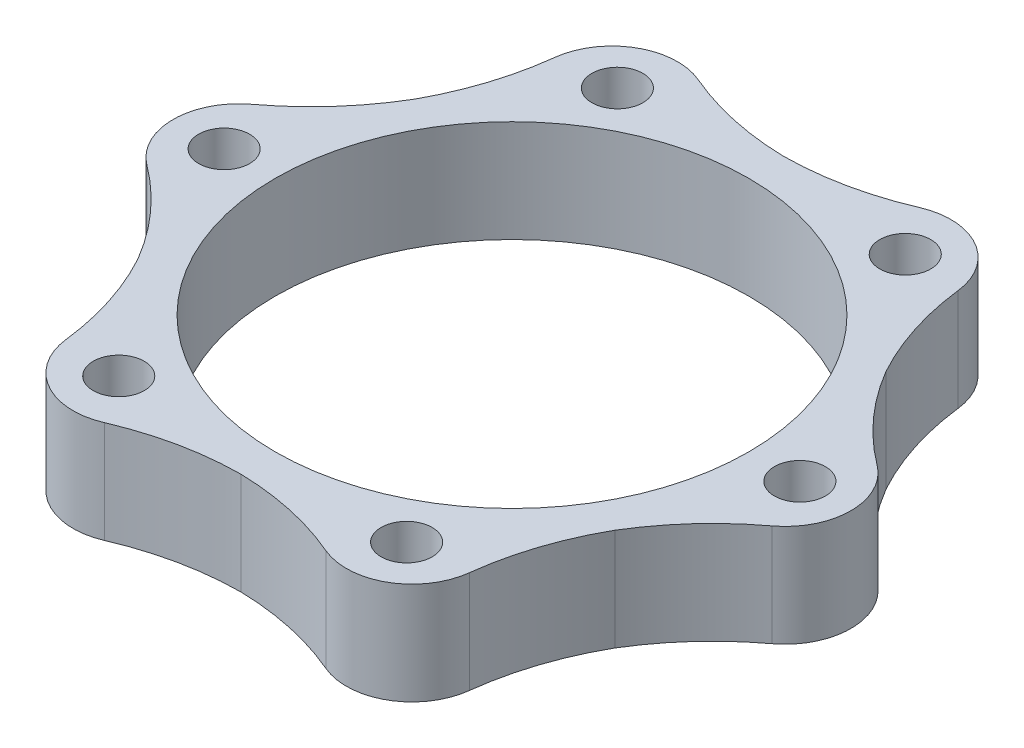
ISO-10303-21;
HEADER;
FILE_DESCRIPTION(('STEP AP214'),'2;1');
FILE_NAME('part.step','',(''),(''),'','','');
FILE_SCHEMA(('AUTOMOTIVE_DESIGN { 1 0 10303 214 1 1 1 1 }'));
ENDSEC;
DATA;
#1=APPLICATION_CONTEXT('core data for automotive mechanical design processes');
#2=APPLICATION_PROTOCOL_DEFINITION('international standard','automotive_design',2000,#1);
#3=PRODUCT_CONTEXT('',#1,'mechanical');
#4=PRODUCT('Part','Part','',(#3));
#5=PRODUCT_RELATED_PRODUCT_CATEGORY('part','',(#4));
#6=PRODUCT_DEFINITION_FORMATION('','',#4);
#7=PRODUCT_DEFINITION_CONTEXT('part definition',#1,'design');
#8=PRODUCT_DEFINITION('design','',#6,#7);
#9=PRODUCT_DEFINITION_SHAPE('','',#8);
#10=(LENGTH_UNIT() NAMED_UNIT(*) SI_UNIT(.MILLI.,.METRE.));
#11=(NAMED_UNIT(*) PLANE_ANGLE_UNIT() SI_UNIT($,.RADIAN.));
#12=(NAMED_UNIT(*) SI_UNIT($,.STERADIAN.) SOLID_ANGLE_UNIT());
#13=UNCERTAINTY_MEASURE_WITH_UNIT(LENGTH_MEASURE(1.E-05),#10,'distance_accuracy_value','');
#14=(GEOMETRIC_REPRESENTATION_CONTEXT(3) GLOBAL_UNCERTAINTY_ASSIGNED_CONTEXT((#13)) GLOBAL_UNIT_ASSIGNED_CONTEXT((#10,
#11,#12)) REPRESENTATION_CONTEXT('',''));
#15=CARTESIAN_POINT('',(0.,0.,0.));
#16=DIRECTION('',(0.,0.,1.));
#17=DIRECTION('',(1.,0.,0.));
#18=AXIS2_PLACEMENT_3D('',#15,#16,#17);
#19=CARTESIAN_POINT('',(0.,0.,0.));
#20=DIRECTION('',(0.,1.,0.));
#21=DIRECTION('',(0.,0.,1.));
#22=AXIS2_PLACEMENT_3D('',#19,#20,#21);
#23=PLANE('',#22);
#24=CARTESIAN_POINT('',(-12.5412500000003,0.,21.722082190423));
#25=DIRECTION('',(0.,1.,0.));
#26=DIRECTION('',(0.866025403784433,0.,0.50000000000001));
#27=AXIS2_PLACEMENT_3D('',#24,#25,#26);
#28=CIRCLE('',#27,2.2225);
#29=CARTESIAN_POINT('',(-10.6165085400894,0.,22.8333321904231));
#30=VERTEX_POINT('',#29);
#31=EDGE_CURVE('E493',#30,#30,#28,.T.);
#32=ORIENTED_EDGE('',*,*,#31,.T.);
#33=EDGE_LOOP('',(#32));
#34=FACE_BOUND('',#33,.T.);
#35=CARTESIAN_POINT('',(12.5412499999998,0.,21.7220821904233));
#36=DIRECTION('',(0.,1.,0.));
#37=DIRECTION('',(0.866025403784443,0.,-0.499999999999992));
#38=AXIS2_PLACEMENT_3D('',#35,#36,#37);
#39=CIRCLE('',#38,2.2225);
#40=CARTESIAN_POINT('',(14.4659914599107,0.,20.6108321904233));
#41=VERTEX_POINT('',#40);
#42=EDGE_CURVE('E489',#41,#41,#39,.T.);
#43=ORIENTED_EDGE('',*,*,#42,.T.);
#44=EDGE_LOOP('',(#43));
#45=FACE_BOUND('',#44,.T.);
#46=CARTESIAN_POINT('',(25.0825,0.,0.));
#47=DIRECTION('',(0.,1.,0.));
#48=DIRECTION('',(0.,0.,-1.));
#49=AXIS2_PLACEMENT_3D('',#46,#47,#48);
#50=CIRCLE('',#49,2.2225);
#51=CARTESIAN_POINT('',(25.0825,0.,-2.2225));
#52=VERTEX_POINT('',#51);
#53=EDGE_CURVE('E484',#52,#52,#50,.T.);
#54=ORIENTED_EDGE('',*,*,#53,.T.);
#55=EDGE_LOOP('',(#54));
#56=FACE_BOUND('',#55,.T.);
#57=CARTESIAN_POINT('',(12.5412500000001,0.,-21.7220821904231));
#58=DIRECTION('',(0.,1.,0.));
#59=DIRECTION('',(-0.866025403784436,0.,-0.500000000000004));
#60=AXIS2_PLACEMENT_3D('',#57,#58,#59);
#61=CIRCLE('',#60,2.2225);
#62=CARTESIAN_POINT('',(10.6165085400892,0.,-22.8333321904231));
#63=VERTEX_POINT('',#62);
#64=EDGE_CURVE('E482',#63,#63,#61,.T.);
#65=ORIENTED_EDGE('',*,*,#64,.T.);
#66=EDGE_LOOP('',(#65));
#67=FACE_BOUND('',#66,.T.);
#68=CARTESIAN_POINT('',(-12.54125,0.,-21.7220821904232));
#69=DIRECTION('',(0.,1.,0.));
#70=DIRECTION('',(-0.86602540378444,0.,0.499999999999998));
#71=AXIS2_PLACEMENT_3D('',#68,#69,#70);
#72=CIRCLE('',#71,2.2225);
#73=CARTESIAN_POINT('',(-14.4659914599109,0.,-20.6108321904232));
#74=VERTEX_POINT('',#73);
#75=EDGE_CURVE('E290',#74,#74,#72,.T.);
#76=ORIENTED_EDGE('',*,*,#75,.T.);
#77=EDGE_LOOP('',(#76));
#78=FACE_BOUND('',#77,.T.);
#79=CARTESIAN_POINT('',(-25.0825,0.,0.));
#80=DIRECTION('',(0.,1.,0.));
#81=DIRECTION('',(0.,0.,1.));
#82=AXIS2_PLACEMENT_3D('',#79,#80,#81);
#83=CIRCLE('',#82,2.2225);
#84=CARTESIAN_POINT('',(-25.0825,0.,2.2225));
#85=VERTEX_POINT('',#84);
#86=EDGE_CURVE('E285',#85,#85,#83,.T.);
#87=ORIENTED_EDGE('',*,*,#86,.T.);
#88=EDGE_LOOP('',(#87));
#89=FACE_BOUND('',#88,.T.);
#90=CARTESIAN_POINT('',(-11.90625,0.,20.622229927617));
#91=DIRECTION('',(0.,1.,0.));
#92=DIRECTION('',(0.,0.,1.));
#93=AXIS2_PLACEMENT_3D('',#90,#91,#92);
#94=CIRCLE('',#93,5.715);
#95=CARTESIAN_POINT('',(-9.65056900120422,0.,25.8732420425975));
#96=VERTEX_POINT('',#95);
#97=CARTESIAN_POINT('',(-17.5819082559492,0.,21.2916538304433));
#98=VERTEX_POINT('',#97);
#99=EDGE_CURVE('E175',#96,#98,#94,.F.);
#100=ORIENTED_EDGE('',*,*,#99,.T.);
#101=CARTESIAN_POINT('',(-42.807056060168,0.,24.2668711763381));
#102=DIRECTION('',(0.,1.,0.));
#103=DIRECTION('',(0.,0.,1.));
#104=AXIS2_PLACEMENT_3D('',#101,#102,#103);
#105=CIRCLE('',#104,25.4);
#106=CARTESIAN_POINT('',(-20.5309838709677,0.,12.0629124816548));
#107=VERTEX_POINT('',#106);
#108=EDGE_CURVE('E168',#98,#107,#105,.T.);
#109=ORIENTED_EDGE('',*,*,#108,.T.);
#110=CARTESIAN_POINT('',(-42.4307,0.,24.9300191287532));
#111=DIRECTION('',(0.,1.,0.));
#112=DIRECTION('',(0.,0.,1.));
#113=AXIS2_PLACEMENT_3D('',#110,#111,#112);
#114=CIRCLE('',#113,25.4);
#115=CARTESIAN_POINT('',(-27.2321693877551,0.,4.5789831052812));
#116=VERTEX_POINT('',#115);
#117=EDGE_CURVE('E172',#107,#116,#114,.T.);
#118=ORIENTED_EDGE('',*,*,#117,.T.);
#119=CARTESIAN_POINT('',(-23.8125,0.,0.));
#120=DIRECTION('',(0.,1.,0.));
#121=DIRECTION('',(0.,0.,1.));
#122=AXIS2_PLACEMENT_3D('',#119,#120,#121);
#123=CIRCLE('',#122,5.715);
#124=CARTESIAN_POINT('',(-27.2321693877551,0.,-4.5789831052812));
#125=VERTEX_POINT('',#124);
#126=EDGE_CURVE('E336',#116,#125,#123,.F.);
#127=ORIENTED_EDGE('',*,*,#126,.T.);
#128=CARTESIAN_POINT('',(-42.4307,0.,-24.9300191287532));
#129=DIRECTION('',(0.,1.,0.));
#130=DIRECTION('',(0.,0.,1.));
#131=AXIS2_PLACEMENT_3D('',#128,#129,#130);
#132=CIRCLE('',#131,25.4);
#133=CARTESIAN_POINT('',(-20.5309838709677,0.,-12.0629124816548));
#134=VERTEX_POINT('',#133);
#135=EDGE_CURVE('E208',#125,#134,#132,.T.);
#136=ORIENTED_EDGE('',*,*,#135,.T.);
#137=CARTESIAN_POINT('',(-42.8070560601683,0.,-24.2668711763375));
#138=DIRECTION('',(0.,1.,0.));
#139=DIRECTION('',(0.,0.,1.));
#140=AXIS2_PLACEMENT_3D('',#137,#138,#139);
#141=CIRCLE('',#140,25.4);
#142=CARTESIAN_POINT('',(-17.5819082559495,0.,-21.2916538304431));
#143=VERTEX_POINT('',#142);
#144=EDGE_CURVE('E11',#134,#143,#141,.T.);
#145=ORIENTED_EDGE('',*,*,#144,.T.);
#146=CARTESIAN_POINT('',(-11.9062500000002,0.,-20.6222299276168));
#147=DIRECTION('',(0.,1.,0.));
#148=DIRECTION('',(0.,0.,1.));
#149=AXIS2_PLACEMENT_3D('',#146,#147,#148);
#150=CIRCLE('',#149,5.715);
#151=CARTESIAN_POINT('',(-9.6481589777738,0.,-25.8722061118809));
#152=VERTEX_POINT('',#151);
#153=EDGE_CURVE('E309',#143,#152,#150,.F.);
#154=ORIENTED_EDGE('',*,*,#153,.T.);
#155=CARTESIAN_POINT('',(0.387801121010369,0.,-49.2054335974992));
#156=DIRECTION('',(0.,1.,0.));
#157=DIRECTION('',(0.,0.,1.));
#158=AXIS2_PLACEMENT_3D('',#155,#156,#157);
#159=CIRCLE('',#158,25.4);
#160=CARTESIAN_POINT('',(-0.181296717257759,0.,-23.811809837774));
#161=VERTEX_POINT('',#160);
#162=EDGE_CURVE('E278',#152,#161,#159,.T.);
#163=ORIENTED_EDGE('',*,*,#162,.T.);
#164=CARTESIAN_POINT('',(-0.374679882332703,0.,-49.211073664733));
#165=DIRECTION('',(0.,1.,0.));
#166=DIRECTION('',(0.,0.,1.));
#167=AXIS2_PLACEMENT_3D('',#164,#165,#166);
#168=CIRCLE('',#167,25.4);
#169=CARTESIAN_POINT('',(9.65056900120404,0.,-25.8732420425975));
#170=VERTEX_POINT('',#169);
#171=EDGE_CURVE('E271',#161,#170,#168,.T.);
#172=ORIENTED_EDGE('',*,*,#171,.T.);
#173=CARTESIAN_POINT('',(11.9062499999998,0.,-20.6222299276171));
#174=DIRECTION('',(0.,1.,0.));
#175=DIRECTION('',(0.,0.,1.));
#176=AXIS2_PLACEMENT_3D('',#173,#174,#175);
#177=CIRCLE('',#176,5.715);
#178=CARTESIAN_POINT('',(17.581908255949,0.,-21.2916538304434));
#179=VERTEX_POINT('',#178);
#180=EDGE_CURVE('E314',#170,#179,#177,.F.);
#181=ORIENTED_EDGE('',*,*,#180,.T.);
#182=CARTESIAN_POINT('',(42.8070560601678,0.,-24.2668711763384));
#183=DIRECTION('',(0.,1.,0.));
#184=DIRECTION('',(0.,0.,1.));
#185=AXIS2_PLACEMENT_3D('',#182,#183,#184);
#186=CIRCLE('',#185,25.4);
#187=CARTESIAN_POINT('',(20.5309838709677,0.,-12.0629124816548));
#188=VERTEX_POINT('',#187);
#189=EDGE_CURVE('E267',#179,#188,#186,.T.);
#190=ORIENTED_EDGE('',*,*,#189,.T.);
#191=CARTESIAN_POINT('',(42.4307,0.,-24.9300191287532));
#192=DIRECTION('',(0.,1.,0.));
#193=DIRECTION('',(0.,0.,1.));
#194=AXIS2_PLACEMENT_3D('',#191,#192,#193);
#195=CIRCLE('',#194,25.4);
#196=CARTESIAN_POINT('',(27.2321693877551,0.,-4.5789831052812));
#197=VERTEX_POINT('',#196);
#198=EDGE_CURVE('E255',#188,#197,#195,.T.);
#199=ORIENTED_EDGE('',*,*,#198,.T.);
#200=CARTESIAN_POINT('',(23.8125,0.,0.));
#201=DIRECTION('',(0.,1.,0.));
#202=DIRECTION('',(0.,0.,1.));
#203=AXIS2_PLACEMENT_3D('',#200,#201,#202);
#204=CIRCLE('',#203,5.715);
#205=CARTESIAN_POINT('',(27.2300672337227,0.,4.58055228143776));
#206=VERTEX_POINT('',#205);
#207=EDGE_CURVE('E320',#197,#206,#204,.F.);
#208=ORIENTED_EDGE('',*,*,#207,.T.);
#209=CARTESIAN_POINT('',(42.4192549391571,0.,24.9385624211611));
#210=DIRECTION('',(0.,1.,0.));
#211=DIRECTION('',(0.,0.,1.));
#212=AXIS2_PLACEMENT_3D('',#209,#210,#211);
#213=CIRCLE('',#212,25.4);
#214=CARTESIAN_POINT('',(20.7122805882253,0.,11.7488973561192));
#215=VERTEX_POINT('',#214);
#216=EDGE_CURVE('E250',#206,#215,#213,.T.);
#217=ORIENTED_EDGE('',*,*,#216,.T.);
#218=CARTESIAN_POINT('',(42.8053798823324,0.,24.2810545359796));
#219=DIRECTION('',(0.,1.,0.));
#220=DIRECTION('',(0.,0.,1.));
#221=AXIS2_PLACEMENT_3D('',#218,#219,#220);
#222=CIRCLE('',#221,25.4);
#223=CARTESIAN_POINT('',(17.5816003865509,0.,21.2942589373162));
#224=VERTEX_POINT('',#223);
#225=EDGE_CURVE('E238',#215,#224,#222,.T.);
#226=ORIENTED_EDGE('',*,*,#225,.T.);
#227=CARTESIAN_POINT('',(11.9062500000001,0.,20.6222299276169));
#228=DIRECTION('',(0.,1.,0.));
#229=DIRECTION('',(0.,0.,1.));
#230=AXIS2_PLACEMENT_3D('',#227,#228,#229);
#231=CIRCLE('',#230,5.715);
#232=CARTESIAN_POINT('',(9.64815897777362,0.,25.872206111881));
#233=VERTEX_POINT('',#232);
#234=EDGE_CURVE('E326',#224,#233,#231,.F.);
#235=ORIENTED_EDGE('',*,*,#234,.T.);
#236=CARTESIAN_POINT('',(-0.387801121010724,0.,49.2054335974992));
#237=DIRECTION('',(0.,1.,0.));
#238=DIRECTION('',(0.,0.,1.));
#239=AXIS2_PLACEMENT_3D('',#236,#237,#238);
#240=CIRCLE('',#239,25.4);
#241=CARTESIAN_POINT('',(0.1812967172576,0.,23.811809837774));
#242=VERTEX_POINT('',#241);
#243=EDGE_CURVE('E233',#233,#242,#240,.T.);
#244=ORIENTED_EDGE('',*,*,#243,.T.);
#245=CARTESIAN_POINT('',(0.374679882332373,0.,49.211073664733));
#246=DIRECTION('',(0.,1.,0.));
#247=DIRECTION('',(0.,0.,1.));
#248=AXIS2_PLACEMENT_3D('',#245,#246,#247);
#249=CIRCLE('',#248,25.4);
#250=EDGE_CURVE('E221',#242,#96,#249,.T.);
#251=ORIENTED_EDGE('',*,*,#250,.T.);
#252=EDGE_LOOP('',(#100,#109,#118,#127,#136,#145,#154,#163,#172,#181,#190,#199,#208,#217,#226,
#235,#244,#251));
#253=FACE_BOUND('',#252,.T.);
#254=CARTESIAN_POINT('',(0.,0.,0.));
#255=DIRECTION('',(0.,1.,0.));
#256=DIRECTION('',(0.,0.,1.));
#257=AXIS2_PLACEMENT_3D('',#254,#255,#256);
#258=CIRCLE('',#257,20.6375);
#259=CARTESIAN_POINT('',(0.,0.,20.6375));
#260=VERTEX_POINT('',#259);
#261=EDGE_CURVE('E195',#260,#260,#258,.T.);
#262=ORIENTED_EDGE('',*,*,#261,.T.);
#263=EDGE_LOOP('',(#262));
#264=FACE_BOUND('',#263,.T.);
#265=ADVANCED_FACE('F41',(#34,#45,#56,#67,#78,#89,#253,#264),#23,.F.);
#266=CARTESIAN_POINT('',(0.,76.2419209080187,0.));
#267=DIRECTION('',(0.,-1.,0.));
#268=DIRECTION('',(0.,0.,-1.));
#269=AXIS2_PLACEMENT_3D('',#266,#267,#268);
#270=CYLINDRICAL_SURFACE('',#269,20.6375);
#271=ORIENTED_EDGE('',*,*,#261,.F.);
#272=EDGE_LOOP('',(#271));
#273=FACE_BOUND('',#272,.T.);
#274=CARTESIAN_POINT('',(0.,8.89,0.));
#275=DIRECTION('',(0.,1.,0.));
#276=DIRECTION('',(0.,0.,1.));
#277=AXIS2_PLACEMENT_3D('',#274,#275,#276);
#278=CIRCLE('',#277,20.6375);
#279=CARTESIAN_POINT('',(0.,8.89,20.6375));
#280=VERTEX_POINT('',#279);
#281=EDGE_CURVE('E199',#280,#280,#278,.T.);
#282=ORIENTED_EDGE('',*,*,#281,.T.);
#283=EDGE_LOOP('',(#282));
#284=FACE_BOUND('',#283,.T.);
#285=ADVANCED_FACE('F368',(#273,#284),#270,.F.);
#286=CARTESIAN_POINT('',(0.,8.89,0.));
#287=DIRECTION('',(0.,1.,0.));
#288=DIRECTION('',(0.,0.,-1.));
#289=AXIS2_PLACEMENT_3D('',#286,#287,#288);
#290=PLANE('',#289);
#291=CARTESIAN_POINT('',(-12.5412500000003,8.89,21.722082190423));
#292=DIRECTION('',(0.,1.,0.));
#293=DIRECTION('',(0.,0.,1.));
#294=AXIS2_PLACEMENT_3D('',#291,#292,#293);
#295=CIRCLE('',#294,2.2225);
#296=CARTESIAN_POINT('',(-12.5412500000003,8.89,23.944582190423));
#297=VERTEX_POINT('',#296);
#298=EDGE_CURVE('E45',#297,#297,#295,.T.);
#299=ORIENTED_EDGE('',*,*,#298,.F.);
#300=EDGE_LOOP('',(#299));
#301=FACE_BOUND('',#300,.T.);
#302=CARTESIAN_POINT('',(12.5412499999998,8.89,21.7220821904233));
#303=DIRECTION('',(0.,1.,0.));
#304=DIRECTION('',(0.,0.,1.));
#305=AXIS2_PLACEMENT_3D('',#302,#303,#304);
#306=CIRCLE('',#305,2.2225);
#307=CARTESIAN_POINT('',(12.5412499999998,8.89,23.9445821904233));
#308=VERTEX_POINT('',#307);
#309=EDGE_CURVE('E295',#308,#308,#306,.T.);
#310=ORIENTED_EDGE('',*,*,#309,.F.);
#311=EDGE_LOOP('',(#310));
#312=FACE_BOUND('',#311,.T.);
#313=CARTESIAN_POINT('',(25.0825,8.89,0.));
#314=DIRECTION('',(0.,1.,0.));
#315=DIRECTION('',(0.,0.,1.));
#316=AXIS2_PLACEMENT_3D('',#313,#314,#315);
#317=CIRCLE('',#316,2.2225);
#318=CARTESIAN_POINT('',(25.0825,8.89,2.2225));
#319=VERTEX_POINT('',#318);
#320=EDGE_CURVE('E293',#319,#319,#317,.T.);
#321=ORIENTED_EDGE('',*,*,#320,.F.);
#322=EDGE_LOOP('',(#321));
#323=FACE_BOUND('',#322,.T.);
#324=CARTESIAN_POINT('',(12.5412500000001,8.89,-21.7220821904231));
#325=DIRECTION('',(0.,1.,0.));
#326=DIRECTION('',(0.,0.,1.));
#327=AXIS2_PLACEMENT_3D('',#324,#325,#326);
#328=CIRCLE('',#327,2.2225);
#329=CARTESIAN_POINT('',(12.5412500000001,8.89,-19.4995821904231));
#330=VERTEX_POINT('',#329);
#331=EDGE_CURVE('E289',#330,#330,#328,.T.);
#332=ORIENTED_EDGE('',*,*,#331,.F.);
#333=EDGE_LOOP('',(#332));
#334=FACE_BOUND('',#333,.T.);
#335=CARTESIAN_POINT('',(-12.54125,8.89,-21.7220821904232));
#336=DIRECTION('',(0.,1.,0.));
#337=DIRECTION('',(0.,0.,1.));
#338=AXIS2_PLACEMENT_3D('',#335,#336,#337);
#339=CIRCLE('',#338,2.2225);
#340=CARTESIAN_POINT('',(-12.54125,8.89,-19.4995821904232));
#341=VERTEX_POINT('',#340);
#342=EDGE_CURVE('E286',#341,#341,#339,.T.);
#343=ORIENTED_EDGE('',*,*,#342,.F.);
#344=EDGE_LOOP('',(#343));
#345=FACE_BOUND('',#344,.T.);
#346=CARTESIAN_POINT('',(-25.0825,8.89,0.));
#347=DIRECTION('',(0.,1.,0.));
#348=DIRECTION('',(0.,0.,1.));
#349=AXIS2_PLACEMENT_3D('',#346,#347,#348);
#350=CIRCLE('',#349,2.2225);
#351=CARTESIAN_POINT('',(-25.0825,8.89,2.2225));
#352=VERTEX_POINT('',#351);
#353=EDGE_CURVE('E281',#352,#352,#350,.T.);
#354=ORIENTED_EDGE('',*,*,#353,.F.);
#355=EDGE_LOOP('',(#354));
#356=FACE_BOUND('',#355,.T.);
#357=ORIENTED_EDGE('',*,*,#281,.F.);
#358=EDGE_LOOP('',(#357));
#359=FACE_BOUND('',#358,.T.);
#360=CARTESIAN_POINT('',(-23.8125,8.89,0.));
#361=DIRECTION('',(0.,1.,0.));
#362=DIRECTION('',(0.,0.,1.));
#363=AXIS2_PLACEMENT_3D('',#360,#361,#362);
#364=CIRCLE('',#363,5.715);
#365=CARTESIAN_POINT('',(-27.2321693877551,8.89,-4.5789831052812));
#366=VERTEX_POINT('',#365);
#367=CARTESIAN_POINT('',(-27.2321693877551,8.89,4.5789831052812));
#368=VERTEX_POINT('',#367);
#369=EDGE_CURVE('E333',#366,#368,#364,.T.);
#370=ORIENTED_EDGE('',*,*,#369,.T.);
#371=CARTESIAN_POINT('',(-42.4307,8.89,24.9300191287532));
#372=DIRECTION('',(0.,1.,0.));
#373=DIRECTION('',(0.,0.,1.));
#374=AXIS2_PLACEMENT_3D('',#371,#372,#373);
#375=CIRCLE('',#374,25.4);
#376=CARTESIAN_POINT('',(-20.5309838709677,8.89,12.0629124816548));
#377=VERTEX_POINT('',#376);
#378=EDGE_CURVE('E190',#368,#377,#375,.F.);
#379=ORIENTED_EDGE('',*,*,#378,.T.);
#380=CARTESIAN_POINT('',(-42.807056060168,8.89,24.2668711763381));
#381=DIRECTION('',(0.,1.,0.));
#382=DIRECTION('',(0.,0.,1.));
#383=AXIS2_PLACEMENT_3D('',#380,#381,#382);
#384=CIRCLE('',#383,25.4);
#385=CARTESIAN_POINT('',(-17.5819082559492,8.89,21.2916538304433));
#386=VERTEX_POINT('',#385);
#387=EDGE_CURVE('E180',#377,#386,#384,.F.);
#388=ORIENTED_EDGE('',*,*,#387,.T.);
#389=CARTESIAN_POINT('',(-11.90625,8.89,20.622229927617));
#390=DIRECTION('',(0.,1.,0.));
#391=DIRECTION('',(0.86602540378444,0.,0.499999999999998));
#392=AXIS2_PLACEMENT_3D('',#389,#390,#391);
#393=CIRCLE('',#392,5.715);
#394=CARTESIAN_POINT('',(-9.65056900120422,8.89,25.8732420425975));
#395=VERTEX_POINT('',#394);
#396=EDGE_CURVE('E329',#386,#395,#393,.T.);
#397=ORIENTED_EDGE('',*,*,#396,.T.);
#398=CARTESIAN_POINT('',(0.374679882332373,8.89,49.211073664733));
#399=DIRECTION('',(0.,1.,0.));
#400=DIRECTION('',(0.,0.,1.));
#401=AXIS2_PLACEMENT_3D('',#398,#399,#400);
#402=CIRCLE('',#401,25.4);
#403=CARTESIAN_POINT('',(0.1812967172576,8.89,23.811809837774));
#404=VERTEX_POINT('',#403);
#405=EDGE_CURVE('E179',#395,#404,#402,.F.);
#406=ORIENTED_EDGE('',*,*,#405,.T.);
#407=CARTESIAN_POINT('',(-0.387801121010724,8.89,49.2054335974992));
#408=DIRECTION('',(0.,1.,0.));
#409=DIRECTION('',(0.,0.,1.));
#410=AXIS2_PLACEMENT_3D('',#407,#408,#409);
#411=CIRCLE('',#410,25.4);
#412=CARTESIAN_POINT('',(9.64815897777362,8.89,25.872206111881));
#413=VERTEX_POINT('',#412);
#414=EDGE_CURVE('E231',#404,#413,#411,.F.);
#415=ORIENTED_EDGE('',*,*,#414,.T.);
#416=CARTESIAN_POINT('',(11.9062500000001,8.89,20.6222299276169));
#417=DIRECTION('',(0.,1.,0.));
#418=DIRECTION('',(0.866025403784436,0.,-0.500000000000004));
#419=AXIS2_PLACEMENT_3D('',#416,#417,#418);
#420=CIRCLE('',#419,5.715);
#421=CARTESIAN_POINT('',(17.5816003865509,8.89,21.2942589373162));
#422=VERTEX_POINT('',#421);
#423=EDGE_CURVE('E323',#413,#422,#420,.T.);
#424=ORIENTED_EDGE('',*,*,#423,.T.);
#425=CARTESIAN_POINT('',(42.8053798823324,8.89,24.2810545359796));
#426=DIRECTION('',(0.,1.,0.));
#427=DIRECTION('',(0.,0.,1.));
#428=AXIS2_PLACEMENT_3D('',#425,#426,#427);
#429=CIRCLE('',#428,25.4);
#430=CARTESIAN_POINT('',(20.7122805882253,8.89,11.7488973561192));
#431=VERTEX_POINT('',#430);
#432=EDGE_CURVE('E235',#422,#431,#429,.F.);
#433=ORIENTED_EDGE('',*,*,#432,.T.);
#434=CARTESIAN_POINT('',(42.4192549391571,8.89,24.9385624211611));
#435=DIRECTION('',(0.,1.,0.));
#436=DIRECTION('',(0.,0.,1.));
#437=AXIS2_PLACEMENT_3D('',#434,#435,#436);
#438=CIRCLE('',#437,25.4);
#439=CARTESIAN_POINT('',(27.2300672337227,8.89,4.58055228143776));
#440=VERTEX_POINT('',#439);
#441=EDGE_CURVE('E248',#431,#440,#438,.F.);
#442=ORIENTED_EDGE('',*,*,#441,.T.);
#443=CARTESIAN_POINT('',(23.8125,8.89,0.));
#444=DIRECTION('',(0.,1.,0.));
#445=DIRECTION('',(0.,0.,-1.));
#446=AXIS2_PLACEMENT_3D('',#443,#444,#445);
#447=CIRCLE('',#446,5.715);
#448=CARTESIAN_POINT('',(27.2321693877551,8.89,-4.5789831052812));
#449=VERTEX_POINT('',#448);
#450=EDGE_CURVE('E317',#440,#449,#447,.T.);
#451=ORIENTED_EDGE('',*,*,#450,.T.);
#452=CARTESIAN_POINT('',(42.4307,8.89,-24.9300191287532));
#453=DIRECTION('',(0.,1.,0.));
#454=DIRECTION('',(0.,0.,1.));
#455=AXIS2_PLACEMENT_3D('',#452,#453,#454);
#456=CIRCLE('',#455,25.4);
#457=CARTESIAN_POINT('',(20.5309838709677,8.89,-12.0629124816548));
#458=VERTEX_POINT('',#457);
#459=EDGE_CURVE('E252',#449,#458,#456,.F.);
#460=ORIENTED_EDGE('',*,*,#459,.T.);
#461=CARTESIAN_POINT('',(42.8070560601678,8.89,-24.2668711763384));
#462=DIRECTION('',(0.,1.,0.));
#463=DIRECTION('',(0.,0.,1.));
#464=AXIS2_PLACEMENT_3D('',#461,#462,#463);
#465=CIRCLE('',#464,25.4);
#466=CARTESIAN_POINT('',(17.581908255949,8.89,-21.2916538304434));
#467=VERTEX_POINT('',#466);
#468=EDGE_CURVE('E265',#458,#467,#465,.F.);
#469=ORIENTED_EDGE('',*,*,#468,.T.);
#470=CARTESIAN_POINT('',(11.9062499999998,8.89,-20.6222299276171));
#471=DIRECTION('',(0.,1.,0.));
#472=DIRECTION('',(-0.866025403784443,0.,-0.499999999999992));
#473=AXIS2_PLACEMENT_3D('',#470,#471,#472);
#474=CIRCLE('',#473,5.715);
#475=CARTESIAN_POINT('',(9.65056900120404,8.89,-25.8732420425975));
#476=VERTEX_POINT('',#475);
#477=EDGE_CURVE('E312',#467,#476,#474,.T.);
#478=ORIENTED_EDGE('',*,*,#477,.T.);
#479=CARTESIAN_POINT('',(-0.374679882332703,8.89,-49.211073664733));
#480=DIRECTION('',(0.,1.,0.));
#481=DIRECTION('',(0.,0.,1.));
#482=AXIS2_PLACEMENT_3D('',#479,#480,#481);
#483=CIRCLE('',#482,25.4);
#484=CARTESIAN_POINT('',(-0.181296717257759,8.89,-23.811809837774));
#485=VERTEX_POINT('',#484);
#486=EDGE_CURVE('E269',#476,#485,#483,.F.);
#487=ORIENTED_EDGE('',*,*,#486,.T.);
#488=CARTESIAN_POINT('',(0.387801121010369,8.89,-49.2054335974992));
#489=DIRECTION('',(0.,1.,0.));
#490=DIRECTION('',(0.,0.,1.));
#491=AXIS2_PLACEMENT_3D('',#488,#489,#490);
#492=CIRCLE('',#491,25.4);
#493=CARTESIAN_POINT('',(-9.6481589777738,8.89,-25.8722061118809));
#494=VERTEX_POINT('',#493);
#495=EDGE_CURVE('E65',#485,#494,#492,.F.);
#496=ORIENTED_EDGE('',*,*,#495,.T.);
#497=CARTESIAN_POINT('',(-11.9062500000002,8.89,-20.6222299276168));
#498=DIRECTION('',(0.,1.,0.));
#499=DIRECTION('',(-0.866025403784433,0.,0.50000000000001));
#500=AXIS2_PLACEMENT_3D('',#497,#498,#499);
#501=CIRCLE('',#500,5.715);
#502=CARTESIAN_POINT('',(-17.5819082559495,8.89,-21.2916538304431));
#503=VERTEX_POINT('',#502);
#504=EDGE_CURVE('E284',#494,#503,#501,.T.);
#505=ORIENTED_EDGE('',*,*,#504,.T.);
#506=CARTESIAN_POINT('',(-42.8070560601683,8.89,-24.2668711763375));
#507=DIRECTION('',(0.,1.,0.));
#508=DIRECTION('',(0.,0.,1.));
#509=AXIS2_PLACEMENT_3D('',#506,#507,#508);
#510=CIRCLE('',#509,25.4);
#511=CARTESIAN_POINT('',(-20.5309838709677,8.89,-12.0629124816548));
#512=VERTEX_POINT('',#511);
#513=EDGE_CURVE('E50',#503,#512,#510,.F.);
#514=ORIENTED_EDGE('',*,*,#513,.T.);
#515=CARTESIAN_POINT('',(-42.4307,8.89,-24.9300191287532));
#516=DIRECTION('',(0.,1.,0.));
#517=DIRECTION('',(0.,0.,1.));
#518=AXIS2_PLACEMENT_3D('',#515,#516,#517);
#519=CIRCLE('',#518,25.4);
#520=EDGE_CURVE('E206',#512,#366,#519,.F.);
#521=ORIENTED_EDGE('',*,*,#520,.T.);
#522=EDGE_LOOP('',(#370,#379,#388,#397,#406,#415,#424,#433,#442,#451,#460,#469,#478,#487,#496,
#505,#514,#521));
#523=FACE_BOUND('',#522,.T.);
#524=ADVANCED_FACE('F340',(#301,#312,#323,#334,#345,#356,#359,#523),#290,.T.);
#525=CARTESIAN_POINT('',(-23.8125,-13.1001962061642,0.));
#526=DIRECTION('',(0.,1.,0.));
#527=DIRECTION('',(0.,0.,1.));
#528=AXIS2_PLACEMENT_3D('',#525,#526,#527);
#529=CYLINDRICAL_SURFACE('',#528,5.715);
#530=ORIENTED_EDGE('',*,*,#369,.F.);
#531=DIRECTION('',(0.,1.,0.));
#532=VECTOR('',#531,1.);
#533=CARTESIAN_POINT('',(-27.2321693877551,-13.1001962061642,-4.5789831052812));
#534=LINE('',#533,#532);
#535=EDGE_CURVE('E204',#366,#125,#534,.F.);
#536=ORIENTED_EDGE('',*,*,#535,.T.);
#537=ORIENTED_EDGE('',*,*,#126,.F.);
#538=DIRECTION('',(0.,1.,0.));
#539=VECTOR('',#538,1.);
#540=CARTESIAN_POINT('',(-27.2321693877551,-13.1001962061642,4.5789831052812));
#541=LINE('',#540,#539);
#542=EDGE_CURVE('E188',#116,#368,#541,.T.);
#543=ORIENTED_EDGE('',*,*,#542,.T.);
#544=EDGE_LOOP('',(#530,#536,#537,#543));
#545=FACE_BOUND('',#544,.T.);
#546=ADVANCED_FACE('F344',(#545),#529,.T.);
#547=CARTESIAN_POINT('',(-42.4307,-13.1001962061642,-24.9300191287532));
#548=DIRECTION('',(0.,-1.,0.));
#549=DIRECTION('',(0.,0.,-1.));
#550=AXIS2_PLACEMENT_3D('',#547,#548,#549);
#551=CYLINDRICAL_SURFACE('',#550,25.4);
#552=ORIENTED_EDGE('',*,*,#135,.F.);
#553=ORIENTED_EDGE('',*,*,#535,.F.);
#554=ORIENTED_EDGE('',*,*,#520,.F.);
#555=DIRECTION('',(0.,-1.,0.));
#556=VECTOR('',#555,1.);
#557=CARTESIAN_POINT('',(-20.5309838709677,76.2419209080187,-12.0629124816548));
#558=LINE('',#557,#556);
#559=EDGE_CURVE('E194',#134,#512,#558,.F.);
#560=ORIENTED_EDGE('',*,*,#559,.F.);
#561=EDGE_LOOP('',(#552,#553,#554,#560));
#562=FACE_BOUND('',#561,.T.);
#563=ADVANCED_FACE('F347',(#562),#551,.F.);
#564=CARTESIAN_POINT('',(-42.4307,76.2419209080187,24.9300191287532));
#565=DIRECTION('',(0.,-1.,0.));
#566=DIRECTION('',(0.,0.,-1.));
#567=AXIS2_PLACEMENT_3D('',#564,#565,#566);
#568=CYLINDRICAL_SURFACE('',#567,25.4);
#569=ORIENTED_EDGE('',*,*,#117,.F.);
#570=DIRECTION('',(0.,-1.,0.));
#571=VECTOR('',#570,1.);
#572=CARTESIAN_POINT('',(-20.5309838709677,76.2419209080187,12.0629124816548));
#573=LINE('',#572,#571);
#574=EDGE_CURVE('E186',#377,#107,#573,.T.);
#575=ORIENTED_EDGE('',*,*,#574,.F.);
#576=ORIENTED_EDGE('',*,*,#378,.F.);
#577=ORIENTED_EDGE('',*,*,#542,.F.);
#578=EDGE_LOOP('',(#569,#575,#576,#577));
#579=FACE_BOUND('',#578,.T.);
#580=ADVANCED_FACE('F185',(#579),#568,.F.);
#581=CARTESIAN_POINT('',(-11.90625,-14.2834977826209,20.622229927617));
#582=DIRECTION('',(0.,1.,0.));
#583=DIRECTION('',(0.,0.,1.));
#584=AXIS2_PLACEMENT_3D('',#581,#582,#583);
#585=CYLINDRICAL_SURFACE('',#584,5.715);
#586=ORIENTED_EDGE('',*,*,#396,.F.);
#587=DIRECTION('',(0.,1.,0.));
#588=VECTOR('',#587,1.);
#589=CARTESIAN_POINT('',(-17.5819082559492,-14.2834977826209,21.2916538304433));
#590=LINE('',#589,#588);
#591=EDGE_CURVE('E213',#386,#98,#590,.F.);
#592=ORIENTED_EDGE('',*,*,#591,.T.);
#593=ORIENTED_EDGE('',*,*,#99,.F.);
#594=DIRECTION('',(0.,1.,0.));
#595=VECTOR('',#594,1.);
#596=CARTESIAN_POINT('',(-9.65056900120422,-14.2834977826209,25.8732420425975));
#597=LINE('',#596,#595);
#598=EDGE_CURVE('E189',#96,#395,#597,.T.);
#599=ORIENTED_EDGE('',*,*,#598,.T.);
#600=EDGE_LOOP('',(#586,#592,#593,#599));
#601=FACE_BOUND('',#600,.T.);
#602=ADVANCED_FACE('F384',(#601),#585,.T.);
#603=CARTESIAN_POINT('',(11.9062500000001,-14.2834977826209,20.6222299276169));
#604=DIRECTION('',(0.,1.,0.));
#605=DIRECTION('',(0.,0.,1.));
#606=AXIS2_PLACEMENT_3D('',#603,#604,#605);
#607=CYLINDRICAL_SURFACE('',#606,5.715);
#608=ORIENTED_EDGE('',*,*,#423,.F.);
#609=DIRECTION('',(0.,1.,0.));
#610=VECTOR('',#609,1.);
#611=CARTESIAN_POINT('',(9.64815897777362,-14.2834977826209,25.872206111881));
#612=LINE('',#611,#610);
#613=EDGE_CURVE('E226',#413,#233,#612,.F.);
#614=ORIENTED_EDGE('',*,*,#613,.T.);
#615=ORIENTED_EDGE('',*,*,#234,.F.);
#616=DIRECTION('',(0.,1.,0.));
#617=VECTOR('',#616,1.);
#618=CARTESIAN_POINT('',(17.5816003865509,-14.2834977826209,21.2942589373162));
#619=LINE('',#618,#617);
#620=EDGE_CURVE('E223',#224,#422,#619,.T.);
#621=ORIENTED_EDGE('',*,*,#620,.T.);
#622=EDGE_LOOP('',(#608,#614,#615,#621));
#623=FACE_BOUND('',#622,.T.);
#624=ADVANCED_FACE('F439',(#623),#607,.T.);
#625=CARTESIAN_POINT('',(23.8125,-13.1001962061642,0.));
#626=DIRECTION('',(0.,1.,0.));
#627=DIRECTION('',(0.,0.,1.));
#628=AXIS2_PLACEMENT_3D('',#625,#626,#627);
#629=CYLINDRICAL_SURFACE('',#628,5.715);
#630=ORIENTED_EDGE('',*,*,#450,.F.);
#631=DIRECTION('',(0.,1.,0.));
#632=VECTOR('',#631,1.);
#633=CARTESIAN_POINT('',(27.2300672337227,-13.1001962061642,4.58055228143776));
#634=LINE('',#633,#632);
#635=EDGE_CURVE('E243',#440,#206,#634,.F.);
#636=ORIENTED_EDGE('',*,*,#635,.T.);
#637=ORIENTED_EDGE('',*,*,#207,.F.);
#638=DIRECTION('',(0.,1.,0.));
#639=VECTOR('',#638,1.);
#640=CARTESIAN_POINT('',(27.2321693877551,-13.1001962061642,-4.5789831052812));
#641=LINE('',#640,#639);
#642=EDGE_CURVE('E240',#197,#449,#641,.T.);
#643=ORIENTED_EDGE('',*,*,#642,.T.);
#644=EDGE_LOOP('',(#630,#636,#637,#643));
#645=FACE_BOUND('',#644,.T.);
#646=ADVANCED_FACE('F431',(#645),#629,.T.);
#647=CARTESIAN_POINT('',(11.9062499999998,-14.2834977826208,-20.6222299276171));
#648=DIRECTION('',(0.,1.,0.));
#649=DIRECTION('',(0.,0.,1.));
#650=AXIS2_PLACEMENT_3D('',#647,#648,#649);
#651=CYLINDRICAL_SURFACE('',#650,5.715);
#652=ORIENTED_EDGE('',*,*,#477,.F.);
#653=DIRECTION('',(0.,1.,0.));
#654=VECTOR('',#653,1.);
#655=CARTESIAN_POINT('',(17.581908255949,-14.2834977826208,-21.2916538304434));
#656=LINE('',#655,#654);
#657=EDGE_CURVE('E260',#467,#179,#656,.F.);
#658=ORIENTED_EDGE('',*,*,#657,.T.);
#659=ORIENTED_EDGE('',*,*,#180,.F.);
#660=DIRECTION('',(0.,1.,0.));
#661=VECTOR('',#660,1.);
#662=CARTESIAN_POINT('',(9.65056900120404,-14.2834977826208,-25.8732420425975));
#663=LINE('',#662,#661);
#664=EDGE_CURVE('E257',#170,#476,#663,.T.);
#665=ORIENTED_EDGE('',*,*,#664,.T.);
#666=EDGE_LOOP('',(#652,#658,#659,#665));
#667=FACE_BOUND('',#666,.T.);
#668=ADVANCED_FACE('F421',(#667),#651,.T.);
#669=CARTESIAN_POINT('',(-11.9062500000002,-14.2834977826209,-20.6222299276168));
#670=DIRECTION('',(0.,1.,0.));
#671=DIRECTION('',(0.,0.,1.));
#672=AXIS2_PLACEMENT_3D('',#669,#670,#671);
#673=CYLINDRICAL_SURFACE('',#672,5.715);
#674=ORIENTED_EDGE('',*,*,#504,.F.);
#675=DIRECTION('',(0.,1.,0.));
#676=VECTOR('',#675,1.);
#677=CARTESIAN_POINT('',(-9.6481589777738,-14.2834977826209,-25.8722061118809));
#678=LINE('',#677,#676);
#679=EDGE_CURVE('E275',#494,#152,#678,.F.);
#680=ORIENTED_EDGE('',*,*,#679,.T.);
#681=ORIENTED_EDGE('',*,*,#153,.F.);
#682=DIRECTION('',(0.,1.,0.));
#683=VECTOR('',#682,1.);
#684=CARTESIAN_POINT('',(-17.5819082559495,-14.2834977826209,-21.2916538304431));
#685=LINE('',#684,#683);
#686=EDGE_CURVE('E273',#143,#503,#685,.T.);
#687=ORIENTED_EDGE('',*,*,#686,.T.);
#688=EDGE_LOOP('',(#674,#680,#681,#687));
#689=FACE_BOUND('',#688,.T.);
#690=ADVANCED_FACE('F353',(#689),#673,.T.);
#691=CARTESIAN_POINT('',(-42.807056060168,-14.2834977826209,24.2668711763381));
#692=DIRECTION('',(0.,-1.,0.));
#693=DIRECTION('',(0.,0.,-1.));
#694=AXIS2_PLACEMENT_3D('',#691,#692,#693);
#695=CYLINDRICAL_SURFACE('',#694,25.4);
#696=ORIENTED_EDGE('',*,*,#108,.F.);
#697=ORIENTED_EDGE('',*,*,#591,.F.);
#698=ORIENTED_EDGE('',*,*,#387,.F.);
#699=ORIENTED_EDGE('',*,*,#574,.T.);
#700=EDGE_LOOP('',(#696,#697,#698,#699));
#701=FACE_BOUND('',#700,.T.);
#702=ADVANCED_FACE('F192',(#701),#695,.F.);
#703=CARTESIAN_POINT('',(0.374679882332373,76.2419209080187,49.211073664733));
#704=DIRECTION('',(0.,-1.,0.));
#705=DIRECTION('',(0.,0.,-1.));
#706=AXIS2_PLACEMENT_3D('',#703,#704,#705);
#707=CYLINDRICAL_SURFACE('',#706,25.4);
#708=ORIENTED_EDGE('',*,*,#250,.F.);
#709=DIRECTION('',(0.,-1.,0.));
#710=VECTOR('',#709,1.);
#711=CARTESIAN_POINT('',(0.1812967172576,76.2419209080187,23.811809837774));
#712=LINE('',#711,#710);
#713=EDGE_CURVE('E215',#404,#242,#712,.T.);
#714=ORIENTED_EDGE('',*,*,#713,.F.);
#715=ORIENTED_EDGE('',*,*,#405,.F.);
#716=ORIENTED_EDGE('',*,*,#598,.F.);
#717=EDGE_LOOP('',(#708,#714,#715,#716));
#718=FACE_BOUND('',#717,.T.);
#719=ADVANCED_FACE('F387',(#718),#707,.F.);
#720=CARTESIAN_POINT('',(-0.387801121010724,-14.2834977826209,49.2054335974992));
#721=DIRECTION('',(0.,-1.,0.));
#722=DIRECTION('',(0.,0.,-1.));
#723=AXIS2_PLACEMENT_3D('',#720,#721,#722);
#724=CYLINDRICAL_SURFACE('',#723,25.4);
#725=ORIENTED_EDGE('',*,*,#243,.F.);
#726=ORIENTED_EDGE('',*,*,#613,.F.);
#727=ORIENTED_EDGE('',*,*,#414,.F.);
#728=ORIENTED_EDGE('',*,*,#713,.T.);
#729=EDGE_LOOP('',(#725,#726,#727,#728));
#730=FACE_BOUND('',#729,.T.);
#731=ADVANCED_FACE('F390',(#730),#724,.F.);
#732=CARTESIAN_POINT('',(42.8053798823324,76.2419209080187,24.2810545359796));
#733=DIRECTION('',(0.,-1.,0.));
#734=DIRECTION('',(0.,0.,-1.));
#735=AXIS2_PLACEMENT_3D('',#732,#733,#734);
#736=CYLINDRICAL_SURFACE('',#735,25.4);
#737=ORIENTED_EDGE('',*,*,#225,.F.);
#738=DIRECTION('',(0.,-1.,0.));
#739=VECTOR('',#738,1.);
#740=CARTESIAN_POINT('',(20.7122805882253,76.2419209080187,11.7488973561192));
#741=LINE('',#740,#739);
#742=EDGE_CURVE('E228',#431,#215,#741,.T.);
#743=ORIENTED_EDGE('',*,*,#742,.F.);
#744=ORIENTED_EDGE('',*,*,#432,.F.);
#745=ORIENTED_EDGE('',*,*,#620,.F.);
#746=EDGE_LOOP('',(#737,#743,#744,#745));
#747=FACE_BOUND('',#746,.T.);
#748=ADVANCED_FACE('F394',(#747),#736,.F.);
#749=CARTESIAN_POINT('',(42.4192549391571,-13.1001962061642,24.9385624211611));
#750=DIRECTION('',(0.,-1.,0.));
#751=DIRECTION('',(0.,0.,-1.));
#752=AXIS2_PLACEMENT_3D('',#749,#750,#751);
#753=CYLINDRICAL_SURFACE('',#752,25.4);
#754=ORIENTED_EDGE('',*,*,#216,.F.);
#755=ORIENTED_EDGE('',*,*,#635,.F.);
#756=ORIENTED_EDGE('',*,*,#441,.F.);
#757=ORIENTED_EDGE('',*,*,#742,.T.);
#758=EDGE_LOOP('',(#754,#755,#756,#757));
#759=FACE_BOUND('',#758,.T.);
#760=ADVANCED_FACE('F398',(#759),#753,.F.);
#761=CARTESIAN_POINT('',(42.4307,76.2419209080187,-24.9300191287532));
#762=DIRECTION('',(0.,-1.,0.));
#763=DIRECTION('',(0.,0.,-1.));
#764=AXIS2_PLACEMENT_3D('',#761,#762,#763);
#765=CYLINDRICAL_SURFACE('',#764,25.4);
#766=ORIENTED_EDGE('',*,*,#198,.F.);
#767=DIRECTION('',(0.,-1.,0.));
#768=VECTOR('',#767,1.);
#769=CARTESIAN_POINT('',(20.5309838709677,76.2419209080187,-12.0629124816548));
#770=LINE('',#769,#768);
#771=EDGE_CURVE('E245',#458,#188,#770,.T.);
#772=ORIENTED_EDGE('',*,*,#771,.F.);
#773=ORIENTED_EDGE('',*,*,#459,.F.);
#774=ORIENTED_EDGE('',*,*,#642,.F.);
#775=EDGE_LOOP('',(#766,#772,#773,#774));
#776=FACE_BOUND('',#775,.T.);
#777=ADVANCED_FACE('F402',(#776),#765,.F.);
#778=CARTESIAN_POINT('',(42.8070560601678,-14.2834977826208,-24.2668711763384));
#779=DIRECTION('',(0.,-1.,0.));
#780=DIRECTION('',(0.,0.,-1.));
#781=AXIS2_PLACEMENT_3D('',#778,#779,#780);
#782=CYLINDRICAL_SURFACE('',#781,25.4);
#783=ORIENTED_EDGE('',*,*,#189,.F.);
#784=ORIENTED_EDGE('',*,*,#657,.F.);
#785=ORIENTED_EDGE('',*,*,#468,.F.);
#786=ORIENTED_EDGE('',*,*,#771,.T.);
#787=EDGE_LOOP('',(#783,#784,#785,#786));
#788=FACE_BOUND('',#787,.T.);
#789=ADVANCED_FACE('F406',(#788),#782,.F.);
#790=CARTESIAN_POINT('',(-0.374679882332703,76.2419209080187,-49.211073664733));
#791=DIRECTION('',(0.,-1.,0.));
#792=DIRECTION('',(0.,0.,-1.));
#793=AXIS2_PLACEMENT_3D('',#790,#791,#792);
#794=CYLINDRICAL_SURFACE('',#793,25.4);
#795=ORIENTED_EDGE('',*,*,#171,.F.);
#796=DIRECTION('',(0.,-1.,0.));
#797=VECTOR('',#796,1.);
#798=CARTESIAN_POINT('',(-0.181296717257759,76.2419209080187,-23.811809837774));
#799=LINE('',#798,#797);
#800=EDGE_CURVE('E262',#485,#161,#799,.T.);
#801=ORIENTED_EDGE('',*,*,#800,.F.);
#802=ORIENTED_EDGE('',*,*,#486,.F.);
#803=ORIENTED_EDGE('',*,*,#664,.F.);
#804=EDGE_LOOP('',(#795,#801,#802,#803));
#805=FACE_BOUND('',#804,.T.);
#806=ADVANCED_FACE('F365',(#805),#794,.F.);
#807=CARTESIAN_POINT('',(0.387801121010369,-14.2834977826209,-49.2054335974992));
#808=DIRECTION('',(0.,-1.,0.));
#809=DIRECTION('',(0.,0.,-1.));
#810=AXIS2_PLACEMENT_3D('',#807,#808,#809);
#811=CYLINDRICAL_SURFACE('',#810,25.4);
#812=ORIENTED_EDGE('',*,*,#162,.F.);
#813=ORIENTED_EDGE('',*,*,#679,.F.);
#814=ORIENTED_EDGE('',*,*,#495,.F.);
#815=ORIENTED_EDGE('',*,*,#800,.T.);
#816=EDGE_LOOP('',(#812,#813,#814,#815));
#817=FACE_BOUND('',#816,.T.);
#818=ADVANCED_FACE('F357',(#817),#811,.F.);
#819=CARTESIAN_POINT('',(-42.8070560601683,76.2419209080187,-24.2668711763375));
#820=DIRECTION('',(0.,-1.,0.));
#821=DIRECTION('',(0.,0.,-1.));
#822=AXIS2_PLACEMENT_3D('',#819,#820,#821);
#823=CYLINDRICAL_SURFACE('',#822,25.4);
#824=ORIENTED_EDGE('',*,*,#144,.F.);
#825=ORIENTED_EDGE('',*,*,#559,.T.);
#826=ORIENTED_EDGE('',*,*,#513,.F.);
#827=ORIENTED_EDGE('',*,*,#686,.F.);
#828=EDGE_LOOP('',(#824,#825,#826,#827));
#829=FACE_BOUND('',#828,.T.);
#830=ADVANCED_FACE('F43',(#829),#823,.F.);
#831=CARTESIAN_POINT('',(-25.0825,0.,0.));
#832=DIRECTION('',(0.,1.,0.));
#833=DIRECTION('',(0.,0.,1.));
#834=AXIS2_PLACEMENT_3D('',#831,#832,#833);
#835=CYLINDRICAL_SURFACE('',#834,2.2225);
#836=ORIENTED_EDGE('',*,*,#353,.T.);
#837=EDGE_LOOP('',(#836));
#838=FACE_BOUND('',#837,.T.);
#839=ORIENTED_EDGE('',*,*,#86,.F.);
#840=EDGE_LOOP('',(#839));
#841=FACE_BOUND('',#840,.T.);
#842=ADVANCED_FACE('F356',(#838,#841),#835,.F.);
#843=CARTESIAN_POINT('',(-12.54125,0.,-21.7220821904232));
#844=DIRECTION('',(0.,1.,0.));
#845=DIRECTION('',(0.,0.,1.));
#846=AXIS2_PLACEMENT_3D('',#843,#844,#845);
#847=CYLINDRICAL_SURFACE('',#846,2.2225);
#848=ORIENTED_EDGE('',*,*,#342,.T.);
#849=EDGE_LOOP('',(#848));
#850=FACE_BOUND('',#849,.T.);
#851=ORIENTED_EDGE('',*,*,#75,.F.);
#852=EDGE_LOOP('',(#851));
#853=FACE_BOUND('',#852,.T.);
#854=ADVANCED_FACE('F362',(#850,#853),#847,.F.);
#855=CARTESIAN_POINT('',(12.5412500000001,0.,-21.7220821904231));
#856=DIRECTION('',(0.,1.,0.));
#857=DIRECTION('',(0.,0.,1.));
#858=AXIS2_PLACEMENT_3D('',#855,#856,#857);
#859=CYLINDRICAL_SURFACE('',#858,2.2225);
#860=ORIENTED_EDGE('',*,*,#331,.T.);
#861=EDGE_LOOP('',(#860));
#862=FACE_BOUND('',#861,.T.);
#863=ORIENTED_EDGE('',*,*,#64,.F.);
#864=EDGE_LOOP('',(#863));
#865=FACE_BOUND('',#864,.T.);
#866=ADVANCED_FACE('F477',(#862,#865),#859,.F.);
#867=CARTESIAN_POINT('',(25.0825,0.,0.));
#868=DIRECTION('',(0.,1.,0.));
#869=DIRECTION('',(0.,0.,1.));
#870=AXIS2_PLACEMENT_3D('',#867,#868,#869);
#871=CYLINDRICAL_SURFACE('',#870,2.2225);
#872=ORIENTED_EDGE('',*,*,#320,.T.);
#873=EDGE_LOOP('',(#872));
#874=FACE_BOUND('',#873,.T.);
#875=ORIENTED_EDGE('',*,*,#53,.F.);
#876=EDGE_LOOP('',(#875));
#877=FACE_BOUND('',#876,.T.);
#878=ADVANCED_FACE('F503',(#874,#877),#871,.F.);
#879=CARTESIAN_POINT('',(12.5412499999998,0.,21.7220821904233));
#880=DIRECTION('',(0.,1.,0.));
#881=DIRECTION('',(0.,0.,1.));
#882=AXIS2_PLACEMENT_3D('',#879,#880,#881);
#883=CYLINDRICAL_SURFACE('',#882,2.2225);
#884=ORIENTED_EDGE('',*,*,#309,.T.);
#885=EDGE_LOOP('',(#884));
#886=FACE_BOUND('',#885,.T.);
#887=ORIENTED_EDGE('',*,*,#42,.F.);
#888=EDGE_LOOP('',(#887));
#889=FACE_BOUND('',#888,.T.);
#890=ADVANCED_FACE('F498',(#886,#889),#883,.F.);
#891=CARTESIAN_POINT('',(-12.5412500000003,0.,21.722082190423));
#892=DIRECTION('',(0.,1.,0.));
#893=DIRECTION('',(0.,0.,1.));
#894=AXIS2_PLACEMENT_3D('',#891,#892,#893);
#895=CYLINDRICAL_SURFACE('',#894,2.2225);
#896=ORIENTED_EDGE('',*,*,#298,.T.);
#897=EDGE_LOOP('',(#896));
#898=FACE_BOUND('',#897,.T.);
#899=ORIENTED_EDGE('',*,*,#31,.F.);
#900=EDGE_LOOP('',(#899));
#901=FACE_BOUND('',#900,.T.);
#902=ADVANCED_FACE('F496',(#898,#901),#895,.F.);
#903=CLOSED_SHELL('',(#265,#285,#524,#546,#563,#580,#602,#624,#646,#668,#690,#702,#719,#731,
#748,#760,#777,#789,#806,#818,#830,#842,#854,#866,#878,#890,#902));
#904=MANIFOLD_SOLID_BREP('B2',#903);
#905=ADVANCED_BREP_SHAPE_REPRESENTATION('',(#18,#904),#14);
#906=SHAPE_DEFINITION_REPRESENTATION(#9,#905);
ENDSEC;
END-ISO-10303-21;
